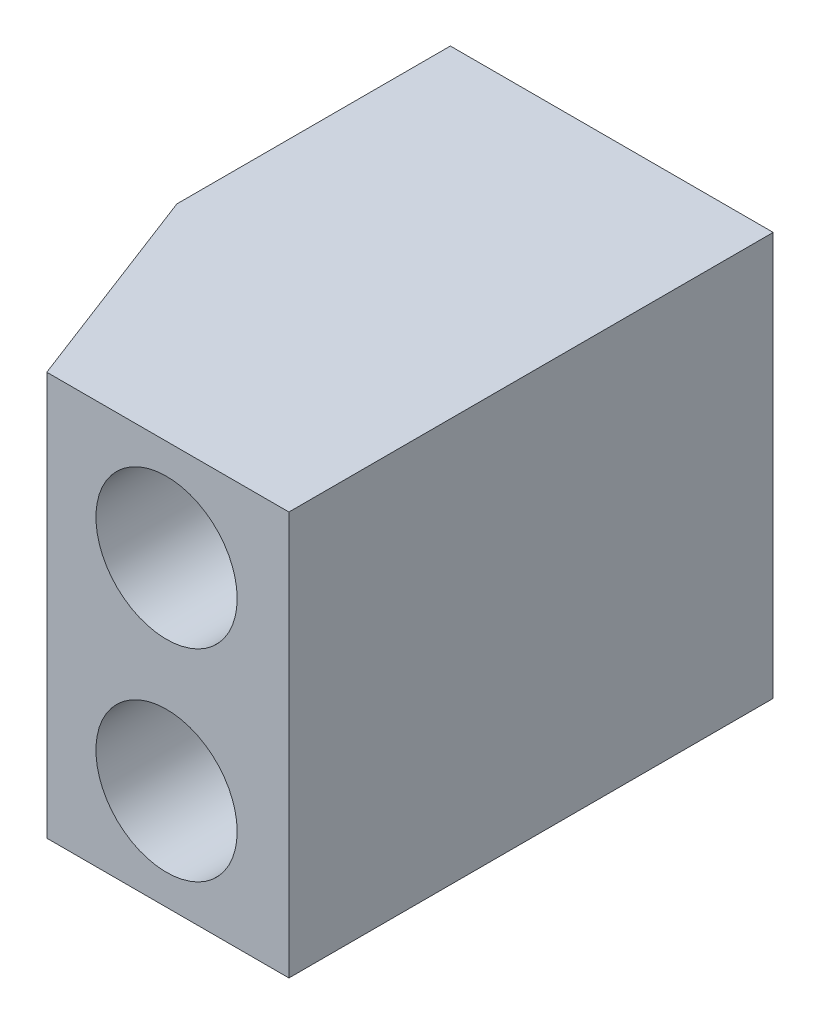
ISO-10303-21;
HEADER;
FILE_DESCRIPTION(('STEP AP214'),'2;1');
FILE_NAME('part.step','',(''),(''),'','','');
FILE_SCHEMA(('AUTOMOTIVE_DESIGN { 1 0 10303 214 1 1 1 1 }'));
ENDSEC;
DATA;
#1=APPLICATION_CONTEXT('core data for automotive mechanical design processes');
#2=APPLICATION_PROTOCOL_DEFINITION('international standard','automotive_design',2000,#1);
#3=PRODUCT_CONTEXT('',#1,'mechanical');
#4=PRODUCT('Part','Part','',(#3));
#5=PRODUCT_RELATED_PRODUCT_CATEGORY('part','',(#4));
#6=PRODUCT_DEFINITION_FORMATION('','',#4);
#7=PRODUCT_DEFINITION_CONTEXT('part definition',#1,'design');
#8=PRODUCT_DEFINITION('design','',#6,#7);
#9=PRODUCT_DEFINITION_SHAPE('','',#8);
#10=(LENGTH_UNIT() NAMED_UNIT(*) SI_UNIT(.MILLI.,.METRE.));
#11=(NAMED_UNIT(*) PLANE_ANGLE_UNIT() SI_UNIT($,.RADIAN.));
#12=(NAMED_UNIT(*) SI_UNIT($,.STERADIAN.) SOLID_ANGLE_UNIT());
#13=UNCERTAINTY_MEASURE_WITH_UNIT(LENGTH_MEASURE(1.E-05),#10,'distance_accuracy_value','');
#14=(GEOMETRIC_REPRESENTATION_CONTEXT(3) GLOBAL_UNCERTAINTY_ASSIGNED_CONTEXT((#13)) GLOBAL_UNIT_ASSIGNED_CONTEXT((#10,
#11,#12)) REPRESENTATION_CONTEXT('',''));
#15=CARTESIAN_POINT('',(0.,0.,0.));
#16=DIRECTION('',(0.,0.,1.));
#17=DIRECTION('',(1.,0.,0.));
#18=AXIS2_PLACEMENT_3D('',#15,#16,#17);
#19=CARTESIAN_POINT('',(-40.85,-7.4,1.6));
#20=DIRECTION('',(-1.,0.,0.));
#21=DIRECTION('',(0.,-1.,0.));
#22=AXIS2_PLACEMENT_3D('',#19,#20,#21);
#23=PLANE('',#22);
#24=DIRECTION('',(0.,-1.,0.));
#25=VECTOR('',#24,1.);
#26=CARTESIAN_POINT('',(-40.85,-7.4,1.6));
#27=LINE('',#26,#25);
#28=CARTESIAN_POINT('',(-40.85,-7.4,1.6));
#29=VERTEX_POINT('',#28);
#30=CARTESIAN_POINT('',(-40.85,-17.4,1.6));
#31=VERTEX_POINT('',#30);
#32=EDGE_CURVE('E36',#29,#31,#27,.T.);
#33=ORIENTED_EDGE('',*,*,#32,.F.);
#34=DIRECTION('',(0.,0.,-1.));
#35=VECTOR('',#34,1.);
#36=CARTESIAN_POINT('',(-40.85,-7.4,13.6));
#37=LINE('',#36,#35);
#38=CARTESIAN_POINT('',(-40.85,-7.4,13.6));
#39=VERTEX_POINT('',#38);
#40=EDGE_CURVE('E371',#39,#29,#37,.T.);
#41=ORIENTED_EDGE('',*,*,#40,.F.);
#42=DIRECTION('',(0.,-1.,0.));
#43=VECTOR('',#42,1.);
#44=CARTESIAN_POINT('',(-40.85,-7.4,13.6));
#45=LINE('',#44,#43);
#46=CARTESIAN_POINT('',(-40.85,-17.4,13.6));
#47=VERTEX_POINT('',#46);
#48=EDGE_CURVE('E11',#39,#47,#45,.T.);
#49=ORIENTED_EDGE('',*,*,#48,.T.);
#50=DIRECTION('',(0.,0.,-1.));
#51=VECTOR('',#50,1.);
#52=CARTESIAN_POINT('',(-40.85,-17.4,13.6));
#53=LINE('',#52,#51);
#54=EDGE_CURVE('E27',#47,#31,#53,.T.);
#55=ORIENTED_EDGE('',*,*,#54,.T.);
#56=EDGE_LOOP('',(#33,#41,#49,#55));
#57=FACE_BOUND('',#56,.T.);
#58=ADVANCED_FACE('F17',(#57),#23,.F.);
#59=CARTESIAN_POINT('',(-40.85,-17.4,1.6));
#60=DIRECTION('',(0.,1.,0.));
#61=DIRECTION('',(-1.,0.,0.));
#62=AXIS2_PLACEMENT_3D('',#59,#60,#61);
#63=PLANE('',#62);
#64=DIRECTION('',(0.,0.,-1.));
#65=VECTOR('',#64,1.);
#66=CARTESIAN_POINT('',(-48.85,-17.4,8.376112079616));
#67=LINE('',#66,#65);
#68=CARTESIAN_POINT('',(-48.85,-17.4,8.376112079616));
#69=VERTEX_POINT('',#68);
#70=CARTESIAN_POINT('',(-48.85,-17.4,1.6));
#71=VERTEX_POINT('',#70);
#72=EDGE_CURVE('E453',#69,#71,#67,.T.);
#73=ORIENTED_EDGE('',*,*,#72,.T.);
#74=DIRECTION('',(-1.,0.,0.));
#75=VECTOR('',#74,1.);
#76=CARTESIAN_POINT('',(-40.85,-17.4,1.6));
#77=LINE('',#76,#75);
#78=EDGE_CURVE('E393',#31,#71,#77,.T.);
#79=ORIENTED_EDGE('',*,*,#78,.F.);
#80=ORIENTED_EDGE('',*,*,#54,.F.);
#81=DIRECTION('',(-1.,0.,0.));
#82=VECTOR('',#81,1.);
#83=CARTESIAN_POINT('',(-40.85,-17.4,13.6));
#84=LINE('',#83,#82);
#85=CARTESIAN_POINT('',(-46.85,-17.4,13.6));
#86=VERTEX_POINT('',#85);
#87=EDGE_CURVE('E369',#47,#86,#84,.T.);
#88=ORIENTED_EDGE('',*,*,#87,.T.);
#89=DIRECTION('',(-0.357547807522008,0.,-0.933894836336622));
#90=VECTOR('',#89,1.);
#91=CARTESIAN_POINT('',(-46.85,-17.4,13.6));
#92=LINE('',#91,#90);
#93=EDGE_CURVE('E378',#86,#69,#92,.T.);
#94=ORIENTED_EDGE('',*,*,#93,.T.);
#95=EDGE_LOOP('',(#73,#79,#80,#88,#94));
#96=FACE_BOUND('',#95,.T.);
#97=ADVANCED_FACE('F165',(#96),#63,.F.);
#98=CARTESIAN_POINT('',(-46.85,-17.4,13.6));
#99=DIRECTION('',(0.933894836336668,0.,-0.357547807521888));
#100=DIRECTION('',(-0.357547807521888,0.,-0.933894836336668));
#101=AXIS2_PLACEMENT_3D('',#98,#99,#100);
#102=PLANE('',#101);
#103=DIRECTION('',(0.,-1.,0.));
#104=VECTOR('',#103,1.);
#105=CARTESIAN_POINT('',(-48.85,-7.4,8.376112079616));
#106=LINE('',#105,#104);
#107=CARTESIAN_POINT('',(-48.85,-7.4,8.376112079616));
#108=VERTEX_POINT('',#107);
#109=EDGE_CURVE('E375',#108,#69,#106,.T.);
#110=ORIENTED_EDGE('',*,*,#109,.T.);
#111=ORIENTED_EDGE('',*,*,#93,.F.);
#112=DIRECTION('',(0.,-1.,0.));
#113=VECTOR('',#112,1.);
#114=CARTESIAN_POINT('',(-46.85,-7.4,13.6));
#115=LINE('',#114,#113);
#116=CARTESIAN_POINT('',(-46.85,-7.4,13.6));
#117=VERTEX_POINT('',#116);
#118=EDGE_CURVE('E136',#117,#86,#115,.T.);
#119=ORIENTED_EDGE('',*,*,#118,.F.);
#120=DIRECTION('',(0.357547807522008,0.,0.933894836336622));
#121=VECTOR('',#120,1.);
#122=CARTESIAN_POINT('',(-48.85,-7.4,8.376112079616));
#123=LINE('',#122,#121);
#124=EDGE_CURVE('E374',#108,#117,#123,.T.);
#125=ORIENTED_EDGE('',*,*,#124,.F.);
#126=EDGE_LOOP('',(#110,#111,#119,#125));
#127=FACE_BOUND('',#126,.T.);
#128=ADVANCED_FACE('F170',(#127),#102,.F.);
#129=CARTESIAN_POINT('',(-48.85,-7.4,1.6));
#130=DIRECTION('',(0.,-1.,0.));
#131=DIRECTION('',(1.,0.,0.));
#132=AXIS2_PLACEMENT_3D('',#129,#130,#131);
#133=PLANE('',#132);
#134=DIRECTION('',(1.,0.,0.));
#135=VECTOR('',#134,1.);
#136=CARTESIAN_POINT('',(-46.85,-7.4,13.6));
#137=LINE('',#136,#135);
#138=EDGE_CURVE('E367',#117,#39,#137,.T.);
#139=ORIENTED_EDGE('',*,*,#138,.T.);
#140=ORIENTED_EDGE('',*,*,#40,.T.);
#141=DIRECTION('',(1.,0.,0.));
#142=VECTOR('',#141,1.);
#143=CARTESIAN_POINT('',(-48.85,-7.4,1.6));
#144=LINE('',#143,#142);
#145=CARTESIAN_POINT('',(-48.85,-7.4,1.6));
#146=VERTEX_POINT('',#145);
#147=EDGE_CURVE('E384',#146,#29,#144,.T.);
#148=ORIENTED_EDGE('',*,*,#147,.F.);
#149=DIRECTION('',(0.,0.,-1.));
#150=VECTOR('',#149,1.);
#151=CARTESIAN_POINT('',(-48.85,-7.4,8.376112079616));
#152=LINE('',#151,#150);
#153=EDGE_CURVE('E387',#108,#146,#152,.T.);
#154=ORIENTED_EDGE('',*,*,#153,.F.);
#155=ORIENTED_EDGE('',*,*,#124,.T.);
#156=EDGE_LOOP('',(#139,#140,#148,#154,#155));
#157=FACE_BOUND('',#156,.T.);
#158=ADVANCED_FACE('F176',(#157),#133,.F.);
#159=CARTESIAN_POINT('',(-48.85,-17.4,1.6));
#160=DIRECTION('',(1.,0.,0.));
#161=DIRECTION('',(0.,1.,0.));
#162=AXIS2_PLACEMENT_3D('',#159,#160,#161);
#163=PLANE('',#162);
#164=ORIENTED_EDGE('',*,*,#153,.T.);
#165=DIRECTION('',(0.,1.,0.));
#166=VECTOR('',#165,1.);
#167=CARTESIAN_POINT('',(-48.85,-17.4,1.6));
#168=LINE('',#167,#166);
#169=EDGE_CURVE('E386',#71,#146,#168,.T.);
#170=ORIENTED_EDGE('',*,*,#169,.F.);
#171=ORIENTED_EDGE('',*,*,#72,.F.);
#172=ORIENTED_EDGE('',*,*,#109,.F.);
#173=EDGE_LOOP('',(#164,#170,#171,#172));
#174=FACE_BOUND('',#173,.T.);
#175=DIRECTION('',(0.,0.,1.));
#176=VECTOR('',#175,1.);
#177=CARTESIAN_POINT('',(-48.85,-8.65,3.6));
#178=LINE('',#177,#176);
#179=CARTESIAN_POINT('',(-48.85,-8.65,3.6));
#180=VERTEX_POINT('',#179);
#181=CARTESIAN_POINT('',(-48.85,-8.65,7.6));
#182=VERTEX_POINT('',#181);
#183=EDGE_CURVE('E390',#180,#182,#178,.T.);
#184=ORIENTED_EDGE('',*,*,#183,.T.);
#185=DIRECTION('',(0.,-1.,0.));
#186=VECTOR('',#185,1.);
#187=CARTESIAN_POINT('',(-48.85,-8.65,7.6));
#188=LINE('',#187,#186);
#189=CARTESIAN_POINT('',(-48.85,-11.15,7.6));
#190=VERTEX_POINT('',#189);
#191=EDGE_CURVE('E396',#182,#190,#188,.T.);
#192=ORIENTED_EDGE('',*,*,#191,.T.);
#193=DIRECTION('',(0.,0.,-1.));
#194=VECTOR('',#193,1.);
#195=CARTESIAN_POINT('',(-48.85,-11.15,7.6));
#196=LINE('',#195,#194);
#197=CARTESIAN_POINT('',(-48.85,-11.15,3.6));
#198=VERTEX_POINT('',#197);
#199=EDGE_CURVE('E399',#190,#198,#196,.T.);
#200=ORIENTED_EDGE('',*,*,#199,.T.);
#201=DIRECTION('',(0.,1.,0.));
#202=VECTOR('',#201,1.);
#203=CARTESIAN_POINT('',(-48.85,-11.15,3.6));
#204=LINE('',#203,#202);
#205=EDGE_CURVE('E402',#198,#180,#204,.T.);
#206=ORIENTED_EDGE('',*,*,#205,.T.);
#207=EDGE_LOOP('',(#184,#192,#200,#206));
#208=FACE_BOUND('',#207,.T.);
#209=DIRECTION('',(0.,0.,1.));
#210=VECTOR('',#209,1.);
#211=CARTESIAN_POINT('',(-48.85,-13.65,3.6));
#212=LINE('',#211,#210);
#213=CARTESIAN_POINT('',(-48.85,-13.65,3.6));
#214=VERTEX_POINT('',#213);
#215=CARTESIAN_POINT('',(-48.85,-13.65,7.6));
#216=VERTEX_POINT('',#215);
#217=EDGE_CURVE('E404',#214,#216,#212,.T.);
#218=ORIENTED_EDGE('',*,*,#217,.T.);
#219=DIRECTION('',(0.,-1.,0.));
#220=VECTOR('',#219,1.);
#221=CARTESIAN_POINT('',(-48.85,-13.65,7.6));
#222=LINE('',#221,#220);
#223=CARTESIAN_POINT('',(-48.85,-16.15,7.6));
#224=VERTEX_POINT('',#223);
#225=EDGE_CURVE('E407',#216,#224,#222,.T.);
#226=ORIENTED_EDGE('',*,*,#225,.T.);
#227=DIRECTION('',(0.,0.,-1.));
#228=VECTOR('',#227,1.);
#229=CARTESIAN_POINT('',(-48.85,-16.15,7.6));
#230=LINE('',#229,#228);
#231=CARTESIAN_POINT('',(-48.85,-16.15,3.6));
#232=VERTEX_POINT('',#231);
#233=EDGE_CURVE('E121',#224,#232,#230,.T.);
#234=ORIENTED_EDGE('',*,*,#233,.T.);
#235=DIRECTION('',(0.,1.,0.));
#236=VECTOR('',#235,1.);
#237=CARTESIAN_POINT('',(-48.85,-16.15,3.6));
#238=LINE('',#237,#236);
#239=EDGE_CURVE('E410',#232,#214,#238,.T.);
#240=ORIENTED_EDGE('',*,*,#239,.T.);
#241=EDGE_LOOP('',(#218,#226,#234,#240));
#242=FACE_BOUND('',#241,.T.);
#243=ADVANCED_FACE('F180',(#174,#208,#242),#163,.F.);
#244=CARTESIAN_POINT('',(0.,0.,1.6));
#245=DIRECTION('',(0.,0.,1.));
#246=DIRECTION('',(1.,0.,0.));
#247=AXIS2_PLACEMENT_3D('',#244,#245,#246);
#248=PLANE('',#247);
#249=ORIENTED_EDGE('',*,*,#78,.T.);
#250=ORIENTED_EDGE('',*,*,#169,.T.);
#251=ORIENTED_EDGE('',*,*,#147,.T.);
#252=ORIENTED_EDGE('',*,*,#32,.T.);
#253=EDGE_LOOP('',(#249,#250,#251,#252));
#254=FACE_BOUND('',#253,.T.);
#255=ADVANCED_FACE('F184',(#254),#248,.F.);
#256=CARTESIAN_POINT('',(-48.85,-11.15,3.6));
#257=DIRECTION('',(0.,0.,-1.));
#258=DIRECTION('',(0.,1.,0.));
#259=AXIS2_PLACEMENT_3D('',#256,#257,#258);
#260=PLANE('',#259);
#261=ORIENTED_EDGE('',*,*,#205,.F.);
#262=DIRECTION('',(-1.,0.,0.));
#263=VECTOR('',#262,1.);
#264=CARTESIAN_POINT('',(-43.85,-11.15,3.6));
#265=LINE('',#264,#263);
#266=CARTESIAN_POINT('',(-43.85,-11.15,3.6));
#267=VERTEX_POINT('',#266);
#268=EDGE_CURVE('E412',#267,#198,#265,.T.);
#269=ORIENTED_EDGE('',*,*,#268,.F.);
#270=DIRECTION('',(0.,1.,0.));
#271=VECTOR('',#270,1.);
#272=CARTESIAN_POINT('',(-43.85,-11.15,3.6));
#273=LINE('',#272,#271);
#274=CARTESIAN_POINT('',(-43.85,-8.65,3.6));
#275=VERTEX_POINT('',#274);
#276=EDGE_CURVE('E416',#267,#275,#273,.T.);
#277=ORIENTED_EDGE('',*,*,#276,.T.);
#278=DIRECTION('',(-1.,0.,0.));
#279=VECTOR('',#278,1.);
#280=CARTESIAN_POINT('',(-43.85,-8.65,3.6));
#281=LINE('',#280,#279);
#282=EDGE_CURVE('E419',#275,#180,#281,.T.);
#283=ORIENTED_EDGE('',*,*,#282,.T.);
#284=EDGE_LOOP('',(#261,#269,#277,#283));
#285=FACE_BOUND('',#284,.T.);
#286=ADVANCED_FACE('F188',(#285),#260,.F.);
#287=CARTESIAN_POINT('',(-48.85,-8.65,3.6));
#288=DIRECTION('',(0.,1.,0.));
#289=DIRECTION('',(0.,0.,1.));
#290=AXIS2_PLACEMENT_3D('',#287,#288,#289);
#291=PLANE('',#290);
#292=ORIENTED_EDGE('',*,*,#183,.F.);
#293=ORIENTED_EDGE('',*,*,#282,.F.);
#294=DIRECTION('',(0.,0.,1.));
#295=VECTOR('',#294,1.);
#296=CARTESIAN_POINT('',(-43.85,-8.65,3.6));
#297=LINE('',#296,#295);
#298=CARTESIAN_POINT('',(-43.85,-8.65,7.6));
#299=VERTEX_POINT('',#298);
#300=EDGE_CURVE('E422',#275,#299,#297,.T.);
#301=ORIENTED_EDGE('',*,*,#300,.T.);
#302=DIRECTION('',(-1.,0.,0.));
#303=VECTOR('',#302,1.);
#304=CARTESIAN_POINT('',(-43.85,-8.65,7.6));
#305=LINE('',#304,#303);
#306=EDGE_CURVE('E425',#299,#182,#305,.T.);
#307=ORIENTED_EDGE('',*,*,#306,.T.);
#308=EDGE_LOOP('',(#292,#293,#301,#307));
#309=FACE_BOUND('',#308,.T.);
#310=ADVANCED_FACE('F192',(#309),#291,.F.);
#311=CARTESIAN_POINT('',(-48.85,-8.65,7.6));
#312=DIRECTION('',(0.,0.,1.));
#313=DIRECTION('',(0.,-1.,0.));
#314=AXIS2_PLACEMENT_3D('',#311,#312,#313);
#315=PLANE('',#314);
#316=ORIENTED_EDGE('',*,*,#191,.F.);
#317=ORIENTED_EDGE('',*,*,#306,.F.);
#318=DIRECTION('',(0.,-1.,0.));
#319=VECTOR('',#318,1.);
#320=CARTESIAN_POINT('',(-43.85,-8.65,7.6));
#321=LINE('',#320,#319);
#322=CARTESIAN_POINT('',(-43.85,-11.15,7.6));
#323=VERTEX_POINT('',#322);
#324=EDGE_CURVE('E428',#299,#323,#321,.T.);
#325=ORIENTED_EDGE('',*,*,#324,.T.);
#326=DIRECTION('',(-1.,0.,0.));
#327=VECTOR('',#326,1.);
#328=CARTESIAN_POINT('',(-43.85,-11.15,7.6));
#329=LINE('',#328,#327);
#330=EDGE_CURVE('E431',#323,#190,#329,.T.);
#331=ORIENTED_EDGE('',*,*,#330,.T.);
#332=EDGE_LOOP('',(#316,#317,#325,#331));
#333=FACE_BOUND('',#332,.T.);
#334=ADVANCED_FACE('F196',(#333),#315,.F.);
#335=CARTESIAN_POINT('',(-48.85,-11.15,7.6));
#336=DIRECTION('',(0.,-1.,0.));
#337=DIRECTION('',(0.,0.,-1.));
#338=AXIS2_PLACEMENT_3D('',#335,#336,#337);
#339=PLANE('',#338);
#340=ORIENTED_EDGE('',*,*,#199,.F.);
#341=ORIENTED_EDGE('',*,*,#330,.F.);
#342=DIRECTION('',(0.,0.,-1.));
#343=VECTOR('',#342,1.);
#344=CARTESIAN_POINT('',(-43.85,-11.15,7.6));
#345=LINE('',#344,#343);
#346=EDGE_CURVE('E415',#323,#267,#345,.T.);
#347=ORIENTED_EDGE('',*,*,#346,.T.);
#348=ORIENTED_EDGE('',*,*,#268,.T.);
#349=EDGE_LOOP('',(#340,#341,#347,#348));
#350=FACE_BOUND('',#349,.T.);
#351=ADVANCED_FACE('F200',(#350),#339,.F.);
#352=CARTESIAN_POINT('',(-43.85,0.,0.));
#353=DIRECTION('',(-1.,0.,0.));
#354=DIRECTION('',(0.,-1.,0.));
#355=AXIS2_PLACEMENT_3D('',#352,#353,#354);
#356=PLANE('',#355);
#357=ORIENTED_EDGE('',*,*,#300,.F.);
#358=ORIENTED_EDGE('',*,*,#276,.F.);
#359=ORIENTED_EDGE('',*,*,#346,.F.);
#360=ORIENTED_EDGE('',*,*,#324,.F.);
#361=EDGE_LOOP('',(#357,#358,#359,#360));
#362=FACE_BOUND('',#361,.T.);
#363=ADVANCED_FACE('F204',(#362),#356,.T.);
#364=CARTESIAN_POINT('',(-48.85,-11.15,3.6));
#365=DIRECTION('',(0.,0.,-1.));
#366=DIRECTION('',(0.,1.,0.));
#367=AXIS2_PLACEMENT_3D('',#364,#365,#366);
#368=PLANE('',#367);
#369=ORIENTED_EDGE('',*,*,#239,.F.);
#370=DIRECTION('',(-1.,0.,0.));
#371=VECTOR('',#370,1.);
#372=CARTESIAN_POINT('',(-43.85,-16.15,3.6));
#373=LINE('',#372,#371);
#374=CARTESIAN_POINT('',(-43.85,-16.15,3.6));
#375=VERTEX_POINT('',#374);
#376=EDGE_CURVE('E134',#375,#232,#373,.T.);
#377=ORIENTED_EDGE('',*,*,#376,.F.);
#378=DIRECTION('',(0.,1.,0.));
#379=VECTOR('',#378,1.);
#380=CARTESIAN_POINT('',(-43.85,-16.15,3.6));
#381=LINE('',#380,#379);
#382=CARTESIAN_POINT('',(-43.85,-13.65,3.6));
#383=VERTEX_POINT('',#382);
#384=EDGE_CURVE('E133',#375,#383,#381,.T.);
#385=ORIENTED_EDGE('',*,*,#384,.T.);
#386=DIRECTION('',(-1.,0.,0.));
#387=VECTOR('',#386,1.);
#388=CARTESIAN_POINT('',(-43.85,-13.65,3.6));
#389=LINE('',#388,#387);
#390=EDGE_CURVE('E437',#383,#214,#389,.T.);
#391=ORIENTED_EDGE('',*,*,#390,.T.);
#392=EDGE_LOOP('',(#369,#377,#385,#391));
#393=FACE_BOUND('',#392,.T.);
#394=ADVANCED_FACE('F208',(#393),#368,.F.);
#395=CARTESIAN_POINT('',(-48.85,-13.65,3.6));
#396=DIRECTION('',(0.,1.,0.));
#397=DIRECTION('',(0.,0.,1.));
#398=AXIS2_PLACEMENT_3D('',#395,#396,#397);
#399=PLANE('',#398);
#400=ORIENTED_EDGE('',*,*,#217,.F.);
#401=ORIENTED_EDGE('',*,*,#390,.F.);
#402=DIRECTION('',(0.,0.,1.));
#403=VECTOR('',#402,1.);
#404=CARTESIAN_POINT('',(-43.85,-13.65,3.6));
#405=LINE('',#404,#403);
#406=CARTESIAN_POINT('',(-43.85,-13.65,7.6));
#407=VERTEX_POINT('',#406);
#408=EDGE_CURVE('E440',#383,#407,#405,.T.);
#409=ORIENTED_EDGE('',*,*,#408,.T.);
#410=DIRECTION('',(-1.,0.,0.));
#411=VECTOR('',#410,1.);
#412=CARTESIAN_POINT('',(-43.85,-13.65,7.6));
#413=LINE('',#412,#411);
#414=EDGE_CURVE('E109',#407,#216,#413,.T.);
#415=ORIENTED_EDGE('',*,*,#414,.T.);
#416=EDGE_LOOP('',(#400,#401,#409,#415));
#417=FACE_BOUND('',#416,.T.);
#418=ADVANCED_FACE('F212',(#417),#399,.F.);
#419=CARTESIAN_POINT('',(-48.85,-8.65,7.6));
#420=DIRECTION('',(0.,0.,1.));
#421=DIRECTION('',(0.,-1.,0.));
#422=AXIS2_PLACEMENT_3D('',#419,#420,#421);
#423=PLANE('',#422);
#424=ORIENTED_EDGE('',*,*,#225,.F.);
#425=ORIENTED_EDGE('',*,*,#414,.F.);
#426=DIRECTION('',(0.,-1.,0.));
#427=VECTOR('',#426,1.);
#428=CARTESIAN_POINT('',(-43.85,-13.65,7.6));
#429=LINE('',#428,#427);
#430=CARTESIAN_POINT('',(-43.85,-16.15,7.6));
#431=VERTEX_POINT('',#430);
#432=EDGE_CURVE('E123',#407,#431,#429,.T.);
#433=ORIENTED_EDGE('',*,*,#432,.T.);
#434=DIRECTION('',(-1.,0.,0.));
#435=VECTOR('',#434,1.);
#436=CARTESIAN_POINT('',(-43.85,-16.15,7.6));
#437=LINE('',#436,#435);
#438=EDGE_CURVE('E115',#431,#224,#437,.T.);
#439=ORIENTED_EDGE('',*,*,#438,.T.);
#440=EDGE_LOOP('',(#424,#425,#433,#439));
#441=FACE_BOUND('',#440,.T.);
#442=ADVANCED_FACE('F126',(#441),#423,.F.);
#443=CARTESIAN_POINT('',(-48.85,-16.15,7.6));
#444=DIRECTION('',(0.,-1.,0.));
#445=DIRECTION('',(0.,0.,-1.));
#446=AXIS2_PLACEMENT_3D('',#443,#444,#445);
#447=PLANE('',#446);
#448=ORIENTED_EDGE('',*,*,#233,.F.);
#449=ORIENTED_EDGE('',*,*,#438,.F.);
#450=DIRECTION('',(0.,0.,-1.));
#451=VECTOR('',#450,1.);
#452=CARTESIAN_POINT('',(-43.85,-16.15,7.6));
#453=LINE('',#452,#451);
#454=EDGE_CURVE('E119',#431,#375,#453,.T.);
#455=ORIENTED_EDGE('',*,*,#454,.T.);
#456=ORIENTED_EDGE('',*,*,#376,.T.);
#457=EDGE_LOOP('',(#448,#449,#455,#456));
#458=FACE_BOUND('',#457,.T.);
#459=ADVANCED_FACE('F116',(#458),#447,.F.);
#460=CARTESIAN_POINT('',(-43.85,0.,0.));
#461=DIRECTION('',(-1.,0.,0.));
#462=DIRECTION('',(0.,-1.,0.));
#463=AXIS2_PLACEMENT_3D('',#460,#461,#462);
#464=PLANE('',#463);
#465=ORIENTED_EDGE('',*,*,#408,.F.);
#466=ORIENTED_EDGE('',*,*,#384,.F.);
#467=ORIENTED_EDGE('',*,*,#454,.F.);
#468=ORIENTED_EDGE('',*,*,#432,.F.);
#469=EDGE_LOOP('',(#465,#466,#467,#468));
#470=FACE_BOUND('',#469,.T.);
#471=ADVANCED_FACE('F131',(#470),#464,.T.);
#472=CARTESIAN_POINT('',(0.,0.,13.6));
#473=DIRECTION('',(0.,0.,1.));
#474=DIRECTION('',(1.,0.,0.));
#475=AXIS2_PLACEMENT_3D('',#472,#473,#474);
#476=PLANE('',#475);
#477=ORIENTED_EDGE('',*,*,#48,.F.);
#478=ORIENTED_EDGE('',*,*,#138,.F.);
#479=ORIENTED_EDGE('',*,*,#118,.T.);
#480=ORIENTED_EDGE('',*,*,#87,.F.);
#481=EDGE_LOOP('',(#477,#478,#479,#480));
#482=FACE_BOUND('',#481,.T.);
#483=CARTESIAN_POINT('',(-43.88256073,-9.9,13.6));
#484=DIRECTION('',(0.,0.,-1.));
#485=DIRECTION('',(1.,0.,0.));
#486=AXIS2_PLACEMENT_3D('',#483,#484,#485);
#487=CIRCLE('',#486,1.75);
#488=CARTESIAN_POINT('',(-42.13256073,-9.9,13.6));
#489=VERTEX_POINT('',#488);
#490=EDGE_CURVE('E139',#489,#489,#487,.T.);
#491=ORIENTED_EDGE('',*,*,#490,.T.);
#492=EDGE_LOOP('',(#491));
#493=FACE_BOUND('',#492,.T.);
#494=CARTESIAN_POINT('',(-43.88256073,-14.9,13.6));
#495=DIRECTION('',(0.,0.,-1.));
#496=DIRECTION('',(1.,0.,0.));
#497=AXIS2_PLACEMENT_3D('',#494,#495,#496);
#498=CIRCLE('',#497,1.75);
#499=CARTESIAN_POINT('',(-42.13256073,-14.9,13.6));
#500=VERTEX_POINT('',#499);
#501=EDGE_CURVE('E142',#500,#500,#498,.T.);
#502=ORIENTED_EDGE('',*,*,#501,.T.);
#503=EDGE_LOOP('',(#502));
#504=FACE_BOUND('',#503,.T.);
#505=ADVANCED_FACE('F223',(#482,#493,#504),#476,.T.);
#506=CARTESIAN_POINT('',(-43.88256073,-9.9,11.1));
#507=DIRECTION('',(0.,0.,1.));
#508=DIRECTION('',(1.,0.,0.));
#509=AXIS2_PLACEMENT_3D('',#506,#507,#508);
#510=CYLINDRICAL_SURFACE('',#509,1.75);
#511=ORIENTED_EDGE('',*,*,#490,.F.);
#512=EDGE_LOOP('',(#511));
#513=FACE_BOUND('',#512,.T.);
#514=CARTESIAN_POINT('',(-43.88256073,-9.9,8.6));
#515=DIRECTION('',(0.,0.,1.));
#516=DIRECTION('',(1.,0.,0.));
#517=AXIS2_PLACEMENT_3D('',#514,#515,#516);
#518=CIRCLE('',#517,1.75);
#519=CARTESIAN_POINT('',(-42.13256073,-9.9,8.6));
#520=VERTEX_POINT('',#519);
#521=EDGE_CURVE('E144',#520,#520,#518,.T.);
#522=ORIENTED_EDGE('',*,*,#521,.F.);
#523=EDGE_LOOP('',(#522));
#524=FACE_BOUND('',#523,.T.);
#525=ADVANCED_FACE('F161',(#513,#524),#510,.F.);
#526=CARTESIAN_POINT('',(0.,0.,8.6));
#527=DIRECTION('',(0.,0.,1.));
#528=DIRECTION('',(1.,0.,0.));
#529=AXIS2_PLACEMENT_3D('',#526,#527,#528);
#530=PLANE('',#529);
#531=ORIENTED_EDGE('',*,*,#521,.T.);
#532=EDGE_LOOP('',(#531));
#533=FACE_BOUND('',#532,.T.);
#534=ADVANCED_FACE('F154',(#533),#530,.T.);
#535=CARTESIAN_POINT('',(-43.88256073,-14.9,11.1));
#536=DIRECTION('',(0.,0.,1.));
#537=DIRECTION('',(1.,0.,0.));
#538=AXIS2_PLACEMENT_3D('',#535,#536,#537);
#539=CYLINDRICAL_SURFACE('',#538,1.75);
#540=ORIENTED_EDGE('',*,*,#501,.F.);
#541=EDGE_LOOP('',(#540));
#542=FACE_BOUND('',#541,.T.);
#543=CARTESIAN_POINT('',(-43.88256073,-14.9,8.6));
#544=DIRECTION('',(0.,0.,1.));
#545=DIRECTION('',(1.,0.,0.));
#546=AXIS2_PLACEMENT_3D('',#543,#544,#545);
#547=CIRCLE('',#546,1.75);
#548=CARTESIAN_POINT('',(-42.13256073,-14.9,8.6));
#549=VERTEX_POINT('',#548);
#550=EDGE_CURVE('E21',#549,#549,#547,.T.);
#551=ORIENTED_EDGE('',*,*,#550,.F.);
#552=EDGE_LOOP('',(#551));
#553=FACE_BOUND('',#552,.T.);
#554=ADVANCED_FACE('F152',(#542,#553),#539,.F.);
#555=CARTESIAN_POINT('',(0.,0.,8.6));
#556=DIRECTION('',(0.,0.,1.));
#557=DIRECTION('',(1.,0.,0.));
#558=AXIS2_PLACEMENT_3D('',#555,#556,#557);
#559=PLANE('',#558);
#560=ORIENTED_EDGE('',*,*,#550,.T.);
#561=EDGE_LOOP('',(#560));
#562=FACE_BOUND('',#561,.T.);
#563=ADVANCED_FACE('F19',(#562),#559,.T.);
#564=CLOSED_SHELL('',(#58,#97,#128,#158,#243,#255,#286,#310,#334,#351,#363,#394,#418,#442,#459,
#471,#505,#525,#534,#554,#563));
#565=MANIFOLD_SOLID_BREP('B1',#564);
#566=ADVANCED_BREP_SHAPE_REPRESENTATION('',(#18,#565),#14);
#567=SHAPE_DEFINITION_REPRESENTATION(#9,#566);
ENDSEC;
END-ISO-10303-21;
